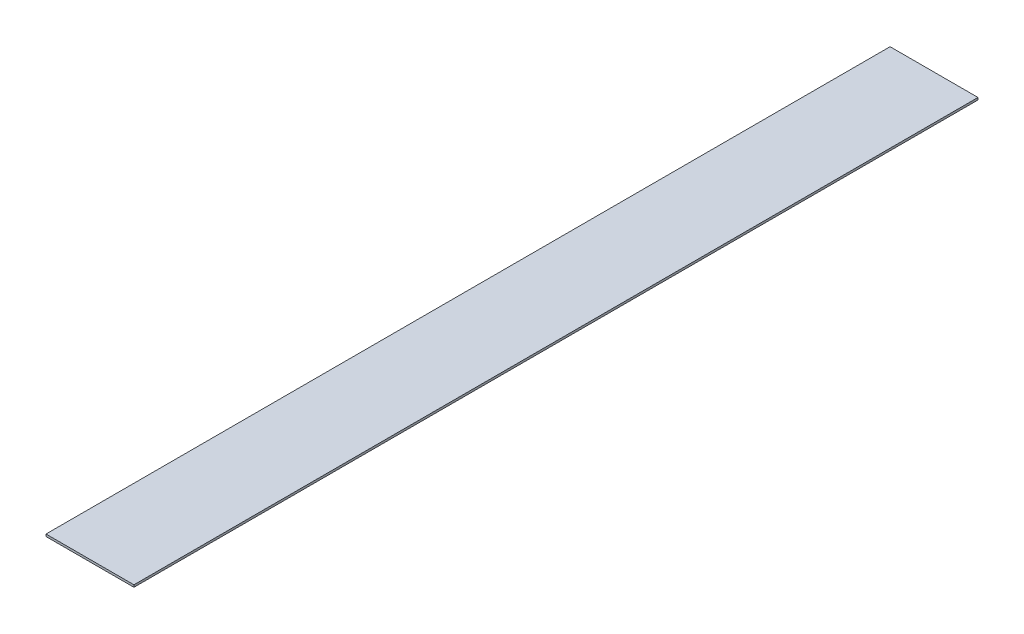
ISO-10303-21;
HEADER;
FILE_DESCRIPTION(('STEP AP214'),'2;1');
FILE_NAME('part.step','',(''),(''),'','','');
FILE_SCHEMA(('AUTOMOTIVE_DESIGN { 1 0 10303 214 1 1 1 1 }'));
ENDSEC;
DATA;
#1=APPLICATION_CONTEXT('core data for automotive mechanical design processes');
#2=APPLICATION_PROTOCOL_DEFINITION('international standard','automotive_design',2000,#1);
#3=PRODUCT_CONTEXT('',#1,'mechanical');
#4=PRODUCT('Part','Part','',(#3));
#5=PRODUCT_RELATED_PRODUCT_CATEGORY('part','',(#4));
#6=PRODUCT_DEFINITION_FORMATION('','',#4);
#7=PRODUCT_DEFINITION_CONTEXT('part definition',#1,'design');
#8=PRODUCT_DEFINITION('design','',#6,#7);
#9=PRODUCT_DEFINITION_SHAPE('','',#8);
#10=(LENGTH_UNIT() NAMED_UNIT(*) SI_UNIT(.MILLI.,.METRE.));
#11=(NAMED_UNIT(*) PLANE_ANGLE_UNIT() SI_UNIT($,.RADIAN.));
#12=(NAMED_UNIT(*) SI_UNIT($,.STERADIAN.) SOLID_ANGLE_UNIT());
#13=UNCERTAINTY_MEASURE_WITH_UNIT(LENGTH_MEASURE(1.E-05),#10,'distance_accuracy_value','');
#14=(GEOMETRIC_REPRESENTATION_CONTEXT(3) GLOBAL_UNCERTAINTY_ASSIGNED_CONTEXT((#13)) GLOBAL_UNIT_ASSIGNED_CONTEXT((#10,
#11,#12)) REPRESENTATION_CONTEXT('',''));
#15=CARTESIAN_POINT('',(0.,0.,0.));
#16=DIRECTION('',(0.,0.,1.));
#17=DIRECTION('',(1.,0.,0.));
#18=AXIS2_PLACEMENT_3D('',#15,#16,#17);
#19=CARTESIAN_POINT('',(100.,2.5,960.));
#20=DIRECTION('',(-1.,0.,0.));
#21=DIRECTION('',(0.,0.,1.));
#22=AXIS2_PLACEMENT_3D('',#19,#20,#21);
#23=PLANE('',#22);
#24=DIRECTION('',(0.,1.,0.));
#25=VECTOR('',#24,1.);
#26=CARTESIAN_POINT('',(100.,2.5,-960.));
#27=LINE('',#26,#25);
#28=CARTESIAN_POINT('',(100.,-2.5,-960.));
#29=VERTEX_POINT('',#28);
#30=CARTESIAN_POINT('',(100.,2.5,-960.));
#31=VERTEX_POINT('',#30);
#32=EDGE_CURVE('E95',#29,#31,#27,.T.);
#33=ORIENTED_EDGE('',*,*,#32,.T.);
#34=DIRECTION('',(0.,0.,-1.));
#35=VECTOR('',#34,1.);
#36=CARTESIAN_POINT('',(100.,2.5,960.));
#37=LINE('',#36,#35);
#38=CARTESIAN_POINT('',(100.,2.5,960.));
#39=VERTEX_POINT('',#38);
#40=EDGE_CURVE('E11',#39,#31,#37,.T.);
#41=ORIENTED_EDGE('',*,*,#40,.F.);
#42=DIRECTION('',(0.,1.,0.));
#43=VECTOR('',#42,1.);
#44=CARTESIAN_POINT('',(100.,2.5,960.));
#45=LINE('',#44,#43);
#46=CARTESIAN_POINT('',(100.,-2.5,960.));
#47=VERTEX_POINT('',#46);
#48=EDGE_CURVE('E83',#47,#39,#45,.T.);
#49=ORIENTED_EDGE('',*,*,#48,.F.);
#50=DIRECTION('',(0.,0.,-1.));
#51=VECTOR('',#50,1.);
#52=CARTESIAN_POINT('',(100.,-2.5,960.));
#53=LINE('',#52,#51);
#54=EDGE_CURVE('E91',#47,#29,#53,.T.);
#55=ORIENTED_EDGE('',*,*,#54,.T.);
#56=EDGE_LOOP('',(#33,#41,#49,#55));
#57=FACE_BOUND('',#56,.T.);
#58=ADVANCED_FACE('F32',(#57),#23,.F.);
#59=CARTESIAN_POINT('',(-100.,2.5,960.));
#60=DIRECTION('',(0.,-1.,0.));
#61=DIRECTION('',(0.,0.,-1.));
#62=AXIS2_PLACEMENT_3D('',#59,#60,#61);
#63=PLANE('',#62);
#64=DIRECTION('',(-1.,0.,0.));
#65=VECTOR('',#64,1.);
#66=CARTESIAN_POINT('',(-100.,2.5,-960.));
#67=LINE('',#66,#65);
#68=CARTESIAN_POINT('',(-100.,2.5,-960.));
#69=VERTEX_POINT('',#68);
#70=EDGE_CURVE('E87',#31,#69,#67,.T.);
#71=ORIENTED_EDGE('',*,*,#70,.T.);
#72=DIRECTION('',(0.,0.,-1.));
#73=VECTOR('',#72,1.);
#74=CARTESIAN_POINT('',(-100.,2.5,960.));
#75=LINE('',#74,#73);
#76=CARTESIAN_POINT('',(-100.,2.5,960.));
#77=VERTEX_POINT('',#76);
#78=EDGE_CURVE('E40',#77,#69,#75,.T.);
#79=ORIENTED_EDGE('',*,*,#78,.F.);
#80=DIRECTION('',(-1.,0.,0.));
#81=VECTOR('',#80,1.);
#82=CARTESIAN_POINT('',(-100.,2.5,960.));
#83=LINE('',#82,#81);
#84=EDGE_CURVE('E78',#39,#77,#83,.T.);
#85=ORIENTED_EDGE('',*,*,#84,.F.);
#86=ORIENTED_EDGE('',*,*,#40,.T.);
#87=EDGE_LOOP('',(#71,#79,#85,#86));
#88=FACE_BOUND('',#87,.T.);
#89=ADVANCED_FACE('F86',(#88),#63,.F.);
#90=CARTESIAN_POINT('',(-100.,2.5,960.));
#91=DIRECTION('',(1.,0.,0.));
#92=DIRECTION('',(0.,0.,-1.));
#93=AXIS2_PLACEMENT_3D('',#90,#91,#92);
#94=PLANE('',#93);
#95=DIRECTION('',(0.,-1.,0.));
#96=VECTOR('',#95,1.);
#97=CARTESIAN_POINT('',(-100.,2.5,-960.));
#98=LINE('',#97,#96);
#99=CARTESIAN_POINT('',(-100.,-2.5,-960.));
#100=VERTEX_POINT('',#99);
#101=EDGE_CURVE('E65',#69,#100,#98,.T.);
#102=ORIENTED_EDGE('',*,*,#101,.T.);
#103=DIRECTION('',(0.,0.,-1.));
#104=VECTOR('',#103,1.);
#105=CARTESIAN_POINT('',(-100.,-2.5,960.));
#106=LINE('',#105,#104);
#107=CARTESIAN_POINT('',(-100.,-2.5,960.));
#108=VERTEX_POINT('',#107);
#109=EDGE_CURVE('E88',#108,#100,#106,.T.);
#110=ORIENTED_EDGE('',*,*,#109,.F.);
#111=DIRECTION('',(0.,-1.,0.));
#112=VECTOR('',#111,1.);
#113=CARTESIAN_POINT('',(-100.,2.5,960.));
#114=LINE('',#113,#112);
#115=EDGE_CURVE('E81',#77,#108,#114,.T.);
#116=ORIENTED_EDGE('',*,*,#115,.F.);
#117=ORIENTED_EDGE('',*,*,#78,.T.);
#118=EDGE_LOOP('',(#102,#110,#116,#117));
#119=FACE_BOUND('',#118,.T.);
#120=ADVANCED_FACE('F89',(#119),#94,.F.);
#121=CARTESIAN_POINT('',(-100.,-2.5,960.));
#122=DIRECTION('',(0.,1.,0.));
#123=DIRECTION('',(0.,0.,1.));
#124=AXIS2_PLACEMENT_3D('',#121,#122,#123);
#125=PLANE('',#124);
#126=DIRECTION('',(1.,0.,0.));
#127=VECTOR('',#126,1.);
#128=CARTESIAN_POINT('',(-100.,-2.5,-960.));
#129=LINE('',#128,#127);
#130=EDGE_CURVE('E71',#100,#29,#129,.T.);
#131=ORIENTED_EDGE('',*,*,#130,.T.);
#132=ORIENTED_EDGE('',*,*,#54,.F.);
#133=DIRECTION('',(1.,0.,0.));
#134=VECTOR('',#133,1.);
#135=CARTESIAN_POINT('',(-100.,-2.5,960.));
#136=LINE('',#135,#134);
#137=EDGE_CURVE('E48',#108,#47,#136,.T.);
#138=ORIENTED_EDGE('',*,*,#137,.F.);
#139=ORIENTED_EDGE('',*,*,#109,.T.);
#140=EDGE_LOOP('',(#131,#132,#138,#139));
#141=FACE_BOUND('',#140,.T.);
#142=ADVANCED_FACE('F102',(#141),#125,.F.);
#143=CARTESIAN_POINT('',(0.,0.,960.));
#144=DIRECTION('',(0.,0.,1.));
#145=DIRECTION('',(1.,0.,0.));
#146=AXIS2_PLACEMENT_3D('',#143,#144,#145);
#147=PLANE('',#146);
#148=ORIENTED_EDGE('',*,*,#48,.T.);
#149=ORIENTED_EDGE('',*,*,#84,.T.);
#150=ORIENTED_EDGE('',*,*,#115,.T.);
#151=ORIENTED_EDGE('',*,*,#137,.T.);
#152=EDGE_LOOP('',(#148,#149,#150,#151));
#153=FACE_BOUND('',#152,.T.);
#154=ADVANCED_FACE('F79',(#153),#147,.T.);
#155=CARTESIAN_POINT('',(0.,0.,-960.));
#156=DIRECTION('',(0.,0.,1.));
#157=DIRECTION('',(1.,0.,0.));
#158=AXIS2_PLACEMENT_3D('',#155,#156,#157);
#159=PLANE('',#158);
#160=ORIENTED_EDGE('',*,*,#32,.F.);
#161=ORIENTED_EDGE('',*,*,#130,.F.);
#162=ORIENTED_EDGE('',*,*,#101,.F.);
#163=ORIENTED_EDGE('',*,*,#70,.F.);
#164=EDGE_LOOP('',(#160,#161,#162,#163));
#165=FACE_BOUND('',#164,.T.);
#166=ADVANCED_FACE('F105',(#165),#159,.F.);
#167=CLOSED_SHELL('',(#58,#89,#120,#142,#154,#166));
#168=MANIFOLD_SOLID_BREP('B2',#167);
#169=ADVANCED_BREP_SHAPE_REPRESENTATION('',(#18,#168),#14);
#170=SHAPE_DEFINITION_REPRESENTATION(#9,#169);
ENDSEC;
END-ISO-10303-21;
